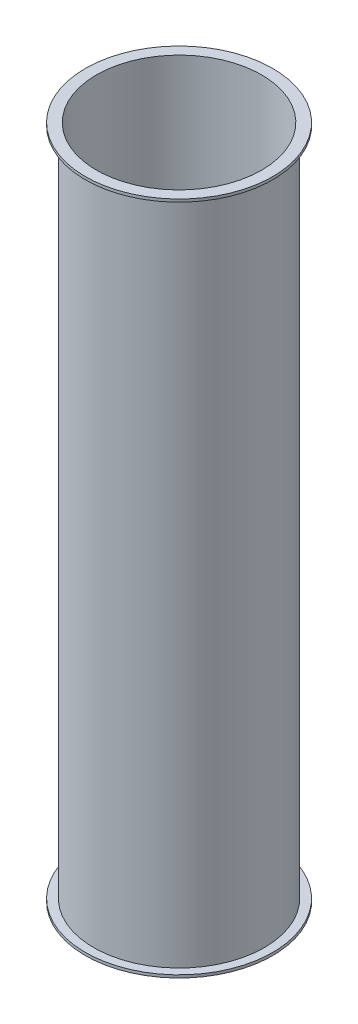
ISO-10303-21;
HEADER;
FILE_DESCRIPTION(('STEP AP214'),'2;1');
FILE_NAME('part.step','',(''),(''),'','','');
FILE_SCHEMA(('AUTOMOTIVE_DESIGN { 1 0 10303 214 1 1 1 1 }'));
ENDSEC;
DATA;
#1=APPLICATION_CONTEXT('core data for automotive mechanical design processes');
#2=APPLICATION_PROTOCOL_DEFINITION('international standard','automotive_design',2000,#1);
#3=PRODUCT_CONTEXT('',#1,'mechanical');
#4=PRODUCT('Part','Part','',(#3));
#5=PRODUCT_RELATED_PRODUCT_CATEGORY('part','',(#4));
#6=PRODUCT_DEFINITION_FORMATION('','',#4);
#7=PRODUCT_DEFINITION_CONTEXT('part definition',#1,'design');
#8=PRODUCT_DEFINITION('design','',#6,#7);
#9=PRODUCT_DEFINITION_SHAPE('','',#8);
#10=(LENGTH_UNIT() NAMED_UNIT(*) SI_UNIT(.MILLI.,.METRE.));
#11=(NAMED_UNIT(*) PLANE_ANGLE_UNIT() SI_UNIT($,.RADIAN.));
#12=(NAMED_UNIT(*) SI_UNIT($,.STERADIAN.) SOLID_ANGLE_UNIT());
#13=UNCERTAINTY_MEASURE_WITH_UNIT(LENGTH_MEASURE(1.E-05),#10,'distance_accuracy_value','');
#14=(GEOMETRIC_REPRESENTATION_CONTEXT(3) GLOBAL_UNCERTAINTY_ASSIGNED_CONTEXT((#13)) GLOBAL_UNIT_ASSIGNED_CONTEXT((#10,
#11,#12)) REPRESENTATION_CONTEXT('',''));
#15=CARTESIAN_POINT('',(0.,0.,0.));
#16=DIRECTION('',(0.,0.,1.));
#17=DIRECTION('',(1.,0.,0.));
#18=AXIS2_PLACEMENT_3D('',#15,#16,#17);
#19=CARTESIAN_POINT('',(-63.5,486.,0.));
#20=DIRECTION('',(0.,1.,0.));
#21=DIRECTION('',(1.,0.,0.));
#22=AXIS2_PLACEMENT_3D('',#19,#20,#21);
#23=PLANE('',#22);
#24=CARTESIAN_POINT('',(0.,486.,0.));
#25=DIRECTION('',(0.,1.,0.));
#26=DIRECTION('',(-1.,0.,0.));
#27=AXIS2_PLACEMENT_3D('',#24,#25,#26);
#28=CIRCLE('',#27,59.5);
#29=CARTESIAN_POINT('',(-59.5,486.,0.));
#30=VERTEX_POINT('',#29);
#31=EDGE_CURVE('E76',#30,#30,#28,.T.);
#32=ORIENTED_EDGE('',*,*,#31,.F.);
#33=EDGE_LOOP('',(#32));
#34=FACE_BOUND('',#33,.T.);
#35=CARTESIAN_POINT('',(0.,486.,0.));
#36=DIRECTION('',(0.,1.,0.));
#37=DIRECTION('',(-1.,0.,0.));
#38=AXIS2_PLACEMENT_3D('',#35,#36,#37);
#39=CIRCLE('',#38,67.5);
#40=CARTESIAN_POINT('',(-67.5,486.,0.));
#41=VERTEX_POINT('',#40);
#42=EDGE_CURVE('E11',#41,#41,#39,.T.);
#43=ORIENTED_EDGE('',*,*,#42,.T.);
#44=EDGE_LOOP('',(#43));
#45=FACE_BOUND('',#44,.T.);
#46=ADVANCED_FACE('F19',(#34,#45),#23,.T.);
#47=CARTESIAN_POINT('',(0.,485.,0.));
#48=DIRECTION('',(0.,1.,0.));
#49=DIRECTION('',(-1.,0.,0.));
#50=AXIS2_PLACEMENT_3D('',#47,#48,#49);
#51=CYLINDRICAL_SURFACE('',#50,67.5);
#52=CARTESIAN_POINT('',(0.,484.,0.));
#53=DIRECTION('',(0.,1.,0.));
#54=DIRECTION('',(-1.,0.,0.));
#55=AXIS2_PLACEMENT_3D('',#52,#53,#54);
#56=CIRCLE('',#55,67.5);
#57=CARTESIAN_POINT('',(-67.5,484.,0.));
#58=VERTEX_POINT('',#57);
#59=EDGE_CURVE('E28',#58,#58,#56,.T.);
#60=ORIENTED_EDGE('',*,*,#59,.T.);
#61=EDGE_LOOP('',(#60));
#62=FACE_BOUND('',#61,.T.);
#63=ORIENTED_EDGE('',*,*,#42,.F.);
#64=EDGE_LOOP('',(#63));
#65=FACE_BOUND('',#64,.T.);
#66=ADVANCED_FACE('F128',(#62,#65),#51,.T.);
#67=CARTESIAN_POINT('',(-64.5,484.,0.));
#68=DIRECTION('',(0.,-1.,0.));
#69=DIRECTION('',(0.,0.,-1.));
#70=AXIS2_PLACEMENT_3D('',#67,#68,#69);
#71=PLANE('',#70);
#72=CARTESIAN_POINT('',(0.,484.,0.));
#73=DIRECTION('',(0.,1.,0.));
#74=DIRECTION('',(-1.,0.,0.));
#75=AXIS2_PLACEMENT_3D('',#72,#73,#74);
#76=CIRCLE('',#75,61.5);
#77=CARTESIAN_POINT('',(-61.5,484.,0.));
#78=VERTEX_POINT('',#77);
#79=EDGE_CURVE('E22',#78,#78,#76,.T.);
#80=ORIENTED_EDGE('',*,*,#79,.T.);
#81=EDGE_LOOP('',(#80));
#82=FACE_BOUND('',#81,.T.);
#83=ORIENTED_EDGE('',*,*,#59,.F.);
#84=EDGE_LOOP('',(#83));
#85=FACE_BOUND('',#84,.T.);
#86=ADVANCED_FACE('F133',(#82,#85),#71,.T.);
#87=CARTESIAN_POINT('',(0.,243.,0.));
#88=DIRECTION('',(0.,1.,0.));
#89=DIRECTION('',(-1.,0.,0.));
#90=AXIS2_PLACEMENT_3D('',#87,#88,#89);
#91=CYLINDRICAL_SURFACE('',#90,61.5);
#92=CARTESIAN_POINT('',(0.,2.00000000000017,0.));
#93=DIRECTION('',(0.,1.,0.));
#94=DIRECTION('',(-1.,0.,0.));
#95=AXIS2_PLACEMENT_3D('',#92,#93,#94);
#96=CIRCLE('',#95,61.5);
#97=CARTESIAN_POINT('',(-61.5,2.00000000000016,0.));
#98=VERTEX_POINT('',#97);
#99=EDGE_CURVE('E57',#98,#98,#96,.T.);
#100=ORIENTED_EDGE('',*,*,#99,.T.);
#101=EDGE_LOOP('',(#100));
#102=FACE_BOUND('',#101,.T.);
#103=ORIENTED_EDGE('',*,*,#79,.F.);
#104=EDGE_LOOP('',(#103));
#105=FACE_BOUND('',#104,.T.);
#106=ADVANCED_FACE('F137',(#102,#105),#91,.T.);
#107=CARTESIAN_POINT('',(-64.5,2.00000000000016,0.));
#108=DIRECTION('',(0.,1.,0.));
#109=DIRECTION('',(1.,0.,0.));
#110=AXIS2_PLACEMENT_3D('',#107,#108,#109);
#111=PLANE('',#110);
#112=ORIENTED_EDGE('',*,*,#99,.F.);
#113=EDGE_LOOP('',(#112));
#114=FACE_BOUND('',#113,.T.);
#115=CARTESIAN_POINT('',(0.,2.00000000000017,0.));
#116=DIRECTION('',(0.,1.,0.));
#117=DIRECTION('',(-1.,0.,0.));
#118=AXIS2_PLACEMENT_3D('',#115,#116,#117);
#119=CIRCLE('',#118,67.5);
#120=CARTESIAN_POINT('',(-67.5,2.00000000000016,0.));
#121=VERTEX_POINT('',#120);
#122=EDGE_CURVE('E66',#121,#121,#119,.T.);
#123=ORIENTED_EDGE('',*,*,#122,.T.);
#124=EDGE_LOOP('',(#123));
#125=FACE_BOUND('',#124,.T.);
#126=ADVANCED_FACE('F145',(#114,#125),#111,.T.);
#127=CARTESIAN_POINT('',(0.,1.00000000000008,0.));
#128=DIRECTION('',(0.,1.,0.));
#129=DIRECTION('',(-1.,0.,0.));
#130=AXIS2_PLACEMENT_3D('',#127,#128,#129);
#131=CYLINDRICAL_SURFACE('',#130,67.5);
#132=CARTESIAN_POINT('',(0.,0.,0.));
#133=DIRECTION('',(0.,1.,0.));
#134=DIRECTION('',(-1.,0.,0.));
#135=AXIS2_PLACEMENT_3D('',#132,#133,#134);
#136=CIRCLE('',#135,67.5);
#137=CARTESIAN_POINT('',(-67.5,0.,0.));
#138=VERTEX_POINT('',#137);
#139=EDGE_CURVE('E92',#138,#138,#136,.T.);
#140=ORIENTED_EDGE('',*,*,#139,.T.);
#141=EDGE_LOOP('',(#140));
#142=FACE_BOUND('',#141,.T.);
#143=ORIENTED_EDGE('',*,*,#122,.F.);
#144=EDGE_LOOP('',(#143));
#145=FACE_BOUND('',#144,.T.);
#146=ADVANCED_FACE('F154',(#142,#145),#131,.T.);
#147=CARTESIAN_POINT('',(-63.5,0.,0.));
#148=DIRECTION('',(0.,-1.,0.));
#149=DIRECTION('',(0.,0.,-1.));
#150=AXIS2_PLACEMENT_3D('',#147,#148,#149);
#151=PLANE('',#150);
#152=CARTESIAN_POINT('',(0.,0.,0.));
#153=DIRECTION('',(0.,1.,0.));
#154=DIRECTION('',(-1.,0.,0.));
#155=AXIS2_PLACEMENT_3D('',#152,#153,#154);
#156=CIRCLE('',#155,59.5);
#157=CARTESIAN_POINT('',(-59.5,0.,0.));
#158=VERTEX_POINT('',#157);
#159=EDGE_CURVE('E82',#158,#158,#156,.T.);
#160=ORIENTED_EDGE('',*,*,#159,.T.);
#161=EDGE_LOOP('',(#160));
#162=FACE_BOUND('',#161,.T.);
#163=ORIENTED_EDGE('',*,*,#139,.F.);
#164=EDGE_LOOP('',(#163));
#165=FACE_BOUND('',#164,.T.);
#166=ADVANCED_FACE('F83',(#162,#165),#151,.T.);
#167=CARTESIAN_POINT('',(0.,243.,0.));
#168=DIRECTION('',(0.,1.,0.));
#169=DIRECTION('',(-1.,0.,0.));
#170=AXIS2_PLACEMENT_3D('',#167,#168,#169);
#171=CYLINDRICAL_SURFACE('',#170,59.5);
#172=ORIENTED_EDGE('',*,*,#31,.T.);
#173=EDGE_LOOP('',(#172));
#174=FACE_BOUND('',#173,.T.);
#175=ORIENTED_EDGE('',*,*,#159,.F.);
#176=EDGE_LOOP('',(#175));
#177=FACE_BOUND('',#176,.T.);
#178=ADVANCED_FACE('F153',(#174,#177),#171,.F.);
#179=CLOSED_SHELL('',(#46,#66,#86,#106,#126,#146,#166,#178));
#180=MANIFOLD_SOLID_BREP('B1',#179);
#181=ADVANCED_BREP_SHAPE_REPRESENTATION('',(#18,#180),#14);
#182=SHAPE_DEFINITION_REPRESENTATION(#9,#181);
ENDSEC;
END-ISO-10303-21;
